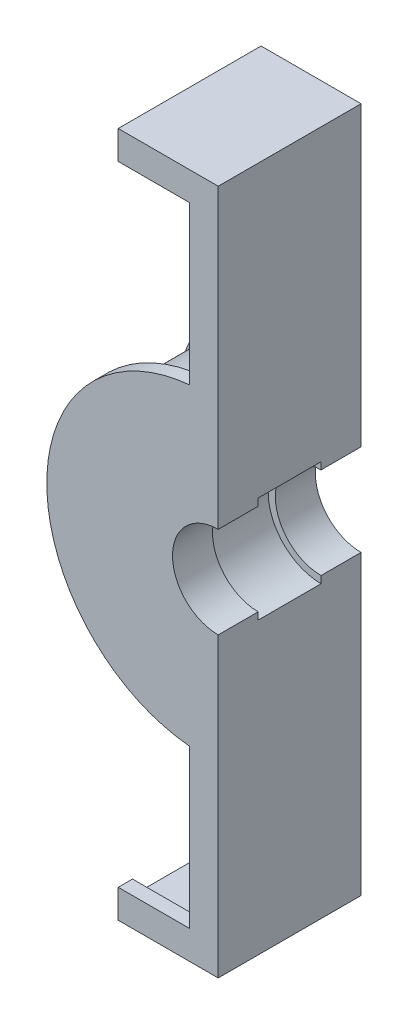
ISO-10303-21;
HEADER;
FILE_DESCRIPTION(('STEP AP214'),'2;1');
FILE_NAME('part.step','',(''),(''),'','','');
FILE_SCHEMA(('AUTOMOTIVE_DESIGN { 1 0 10303 214 1 1 1 1 }'));
ENDSEC;
DATA;
#1=APPLICATION_CONTEXT('core data for automotive mechanical design processes');
#2=APPLICATION_PROTOCOL_DEFINITION('international standard','automotive_design',2000,#1);
#3=PRODUCT_CONTEXT('',#1,'mechanical');
#4=PRODUCT('Part','Part','',(#3));
#5=PRODUCT_RELATED_PRODUCT_CATEGORY('part','',(#4));
#6=PRODUCT_DEFINITION_FORMATION('','',#4);
#7=PRODUCT_DEFINITION_CONTEXT('part definition',#1,'design');
#8=PRODUCT_DEFINITION('design','',#6,#7);
#9=PRODUCT_DEFINITION_SHAPE('','',#8);
#10=(LENGTH_UNIT() NAMED_UNIT(*) SI_UNIT(.MILLI.,.METRE.));
#11=(NAMED_UNIT(*) PLANE_ANGLE_UNIT() SI_UNIT($,.RADIAN.));
#12=(NAMED_UNIT(*) SI_UNIT($,.STERADIAN.) SOLID_ANGLE_UNIT());
#13=UNCERTAINTY_MEASURE_WITH_UNIT(LENGTH_MEASURE(1.E-05),#10,'distance_accuracy_value','');
#14=(GEOMETRIC_REPRESENTATION_CONTEXT(3) GLOBAL_UNCERTAINTY_ASSIGNED_CONTEXT((#13)) GLOBAL_UNIT_ASSIGNED_CONTEXT((#10,
#11,#12)) REPRESENTATION_CONTEXT('',''));
#15=CARTESIAN_POINT('',(0.,0.,0.));
#16=DIRECTION('',(0.,0.,1.));
#17=DIRECTION('',(1.,0.,0.));
#18=AXIS2_PLACEMENT_3D('',#15,#16,#17);
#19=CARTESIAN_POINT('',(5.,0.,45.));
#20=DIRECTION('',(0.,0.,-1.));
#21=DIRECTION('',(-1.,0.,0.));
#22=AXIS2_PLACEMENT_3D('',#19,#20,#21);
#23=CYLINDRICAL_SURFACE('',#22,18.5);
#24=DIRECTION('',(0.,0.,-1.));
#25=VECTOR('',#24,1.);
#26=CARTESIAN_POINT('',(5.,18.5,45.));
#27=LINE('',#26,#25);
#28=CARTESIAN_POINT('',(5.,18.5,31.));
#29=VERTEX_POINT('',#28);
#30=CARTESIAN_POINT('',(5.,18.5,9.));
#31=VERTEX_POINT('',#30);
#32=EDGE_CURVE('E60',#29,#31,#27,.T.);
#33=ORIENTED_EDGE('',*,*,#32,.F.);
#34=CARTESIAN_POINT('',(5.,0.,31.));
#35=DIRECTION('',(0.,0.,-1.));
#36=DIRECTION('',(-1.,0.,0.));
#37=AXIS2_PLACEMENT_3D('',#34,#35,#36);
#38=CIRCLE('',#37,18.5);
#39=CARTESIAN_POINT('',(5.00000000000001,-18.5,31.));
#40=VERTEX_POINT('',#39);
#41=EDGE_CURVE('E55',#40,#29,#38,.T.);
#42=ORIENTED_EDGE('',*,*,#41,.F.);
#43=DIRECTION('',(0.,0.,-1.));
#44=VECTOR('',#43,1.);
#45=CARTESIAN_POINT('',(5.00000000000001,-18.5,45.));
#46=LINE('',#45,#44);
#47=CARTESIAN_POINT('',(5.,-18.5,9.));
#48=VERTEX_POINT('',#47);
#49=EDGE_CURVE('E248',#40,#48,#46,.T.);
#50=ORIENTED_EDGE('',*,*,#49,.T.);
#51=CARTESIAN_POINT('',(5.,0.,9.));
#52=DIRECTION('',(0.,0.,-1.));
#53=DIRECTION('',(-1.,0.,0.));
#54=AXIS2_PLACEMENT_3D('',#51,#52,#53);
#55=CIRCLE('',#54,18.5);
#56=EDGE_CURVE('E261',#48,#31,#55,.T.);
#57=ORIENTED_EDGE('',*,*,#56,.T.);
#58=EDGE_LOOP('',(#33,#42,#50,#57));
#59=FACE_BOUND('',#58,.T.);
#60=ADVANCED_FACE('F39',(#59),#23,.F.);
#61=CARTESIAN_POINT('',(0.,115.,40.));
#62=DIRECTION('',(0.,1.,0.));
#63=DIRECTION('',(0.,0.,1.));
#64=AXIS2_PLACEMENT_3D('',#61,#62,#63);
#65=PLANE('',#64);
#66=DIRECTION('',(1.,0.,0.));
#67=VECTOR('',#66,1.);
#68=CARTESIAN_POINT('',(0.,115.,0.));
#69=LINE('',#68,#67);
#70=CARTESIAN_POINT('',(-30.,115.,0.));
#71=VERTEX_POINT('',#70);
#72=CARTESIAN_POINT('',(0.,115.,0.));
#73=VERTEX_POINT('',#72);
#74=EDGE_CURVE('E459',#71,#73,#69,.T.);
#75=ORIENTED_EDGE('',*,*,#74,.T.);
#76=DIRECTION('',(0.,0.,-1.));
#77=VECTOR('',#76,1.);
#78=CARTESIAN_POINT('',(0.,115.,40.));
#79=LINE('',#78,#77);
#80=CARTESIAN_POINT('',(0.,115.,40.));
#81=VERTEX_POINT('',#80);
#82=EDGE_CURVE('E11',#81,#73,#79,.T.);
#83=ORIENTED_EDGE('',*,*,#82,.F.);
#84=DIRECTION('',(1.,0.,0.));
#85=VECTOR('',#84,1.);
#86=CARTESIAN_POINT('',(0.,115.,40.));
#87=LINE('',#86,#85);
#88=CARTESIAN_POINT('',(-30.,115.,40.));
#89=VERTEX_POINT('',#88);
#90=EDGE_CURVE('E460',#89,#81,#87,.T.);
#91=ORIENTED_EDGE('',*,*,#90,.F.);
#92=DIRECTION('',(0.,0.,-1.));
#93=VECTOR('',#92,1.);
#94=CARTESIAN_POINT('',(-30.,115.,40.));
#95=LINE('',#94,#93);
#96=EDGE_CURVE('E481',#89,#71,#95,.T.);
#97=ORIENTED_EDGE('',*,*,#96,.T.);
#98=EDGE_LOOP('',(#75,#83,#91,#97));
#99=FACE_BOUND('',#98,.T.);
#100=ADVANCED_FACE('F41',(#99),#65,.F.);
#101=CARTESIAN_POINT('',(0.,50.,40.));
#102=DIRECTION('',(1.,0.,0.));
#103=DIRECTION('',(0.,0.,-1.));
#104=AXIS2_PLACEMENT_3D('',#101,#102,#103);
#105=PLANE('',#104);
#106=DIRECTION('',(0.,-1.,0.));
#107=VECTOR('',#106,1.);
#108=CARTESIAN_POINT('',(0.,50.,0.));
#109=LINE('',#108,#107);
#110=CARTESIAN_POINT('',(0.,50.,0.));
#111=VERTEX_POINT('',#110);
#112=EDGE_CURVE('E485',#73,#111,#109,.T.);
#113=ORIENTED_EDGE('',*,*,#112,.T.);
#114=DIRECTION('',(0.,0.,-1.));
#115=VECTOR('',#114,1.);
#116=CARTESIAN_POINT('',(0.,50.,40.));
#117=LINE('',#116,#115);
#118=CARTESIAN_POINT('',(0.,50.,40.));
#119=VERTEX_POINT('',#118);
#120=EDGE_CURVE('E48',#119,#111,#117,.T.);
#121=ORIENTED_EDGE('',*,*,#120,.F.);
#122=DIRECTION('',(0.,-1.,0.));
#123=VECTOR('',#122,1.);
#124=CARTESIAN_POINT('',(0.,50.,40.));
#125=LINE('',#124,#123);
#126=EDGE_CURVE('E464',#81,#119,#125,.T.);
#127=ORIENTED_EDGE('',*,*,#126,.F.);
#128=ORIENTED_EDGE('',*,*,#82,.T.);
#129=EDGE_LOOP('',(#113,#121,#127,#128));
#130=FACE_BOUND('',#129,.T.);
#131=ADVANCED_FACE('F533',(#130),#105,.F.);
#132=CARTESIAN_POINT('',(0.,0.,40.));
#133=DIRECTION('',(0.,0.,-1.));
#134=DIRECTION('',(-1.,0.,0.));
#135=AXIS2_PLACEMENT_3D('',#132,#133,#134);
#136=CYLINDRICAL_SURFACE('',#135,50.);
#137=CARTESIAN_POINT('',(0.,0.,0.));
#138=DIRECTION('',(0.,0.,1.));
#139=DIRECTION('',(1.,0.,0.));
#140=AXIS2_PLACEMENT_3D('',#137,#138,#139);
#141=CIRCLE('',#140,50.);
#142=CARTESIAN_POINT('',(0.,-50.,0.));
#143=VERTEX_POINT('',#142);
#144=EDGE_CURVE('E489',#111,#143,#141,.T.);
#145=ORIENTED_EDGE('',*,*,#144,.T.);
#146=DIRECTION('',(0.,0.,-1.));
#147=VECTOR('',#146,1.);
#148=CARTESIAN_POINT('',(0.,-50.,40.));
#149=LINE('',#148,#147);
#150=CARTESIAN_POINT('',(0.,-50.,40.));
#151=VERTEX_POINT('',#150);
#152=EDGE_CURVE('E524',#151,#143,#149,.T.);
#153=ORIENTED_EDGE('',*,*,#152,.F.);
#154=CARTESIAN_POINT('',(0.,0.,40.));
#155=DIRECTION('',(0.,0.,1.));
#156=DIRECTION('',(1.,0.,0.));
#157=AXIS2_PLACEMENT_3D('',#154,#155,#156);
#158=CIRCLE('',#157,50.);
#159=EDGE_CURVE('E469',#119,#151,#158,.T.);
#160=ORIENTED_EDGE('',*,*,#159,.F.);
#161=ORIENTED_EDGE('',*,*,#120,.T.);
#162=EDGE_LOOP('',(#145,#153,#160,#161));
#163=FACE_BOUND('',#162,.T.);
#164=ADVANCED_FACE('F531',(#163),#136,.T.);
#165=CARTESIAN_POINT('',(0.,-50.,40.));
#166=DIRECTION('',(1.,0.,0.));
#167=DIRECTION('',(0.,0.,-1.));
#168=AXIS2_PLACEMENT_3D('',#165,#166,#167);
#169=PLANE('',#168);
#170=DIRECTION('',(0.,-1.,0.));
#171=VECTOR('',#170,1.);
#172=CARTESIAN_POINT('',(0.,-50.,0.));
#173=LINE('',#172,#171);
#174=CARTESIAN_POINT('',(0.,-115.,0.));
#175=VERTEX_POINT('',#174);
#176=EDGE_CURVE('E493',#143,#175,#173,.T.);
#177=ORIENTED_EDGE('',*,*,#176,.T.);
#178=DIRECTION('',(0.,0.,-1.));
#179=VECTOR('',#178,1.);
#180=CARTESIAN_POINT('',(0.,-115.,40.));
#181=LINE('',#180,#179);
#182=CARTESIAN_POINT('',(0.,-115.,40.));
#183=VERTEX_POINT('',#182);
#184=EDGE_CURVE('E520',#183,#175,#181,.T.);
#185=ORIENTED_EDGE('',*,*,#184,.F.);
#186=DIRECTION('',(0.,-1.,0.));
#187=VECTOR('',#186,1.);
#188=CARTESIAN_POINT('',(0.,-50.,40.));
#189=LINE('',#188,#187);
#190=EDGE_CURVE('E473',#151,#183,#189,.T.);
#191=ORIENTED_EDGE('',*,*,#190,.F.);
#192=ORIENTED_EDGE('',*,*,#152,.T.);
#193=EDGE_LOOP('',(#177,#185,#191,#192));
#194=FACE_BOUND('',#193,.T.);
#195=ADVANCED_FACE('F539',(#194),#169,.F.);
#196=CARTESIAN_POINT('',(-30.,-115.,40.));
#197=DIRECTION('',(0.,-1.,0.));
#198=DIRECTION('',(0.,0.,-1.));
#199=AXIS2_PLACEMENT_3D('',#196,#197,#198);
#200=PLANE('',#199);
#201=DIRECTION('',(-1.,0.,0.));
#202=VECTOR('',#201,1.);
#203=CARTESIAN_POINT('',(-30.,-115.,0.));
#204=LINE('',#203,#202);
#205=CARTESIAN_POINT('',(-30.,-115.,0.));
#206=VERTEX_POINT('',#205);
#207=EDGE_CURVE('E465',#175,#206,#204,.T.);
#208=ORIENTED_EDGE('',*,*,#207,.T.);
#209=DIRECTION('',(0.,0.,-1.));
#210=VECTOR('',#209,1.);
#211=CARTESIAN_POINT('',(-30.,-115.,40.));
#212=LINE('',#211,#210);
#213=CARTESIAN_POINT('',(-30.,-115.,40.));
#214=VERTEX_POINT('',#213);
#215=EDGE_CURVE('E516',#214,#206,#212,.T.);
#216=ORIENTED_EDGE('',*,*,#215,.F.);
#217=DIRECTION('',(-1.,0.,0.));
#218=VECTOR('',#217,1.);
#219=CARTESIAN_POINT('',(-30.,-115.,40.));
#220=LINE('',#219,#218);
#221=EDGE_CURVE('E477',#183,#214,#220,.T.);
#222=ORIENTED_EDGE('',*,*,#221,.F.);
#223=ORIENTED_EDGE('',*,*,#184,.T.);
#224=EDGE_LOOP('',(#208,#216,#222,#223));
#225=FACE_BOUND('',#224,.T.);
#226=ADVANCED_FACE('F543',(#225),#200,.F.);
#227=CARTESIAN_POINT('',(-30.,-120.,40.));
#228=DIRECTION('',(1.,0.,0.));
#229=DIRECTION('',(0.,0.,-1.));
#230=AXIS2_PLACEMENT_3D('',#227,#228,#229);
#231=PLANE('',#230);
#232=ORIENTED_EDGE('',*,*,#215,.T.);
#233=DIRECTION('',(0.,-1.,0.));
#234=VECTOR('',#233,1.);
#235=CARTESIAN_POINT('',(-30.,-120.,0.));
#236=LINE('',#235,#234);
#237=CARTESIAN_POINT('',(-30.,-110.,0.));
#238=VERTEX_POINT('',#237);
#239=EDGE_CURVE('E288',#238,#206,#236,.T.);
#240=ORIENTED_EDGE('',*,*,#239,.F.);
#241=DIRECTION('',(0.,0.,1.));
#242=VECTOR('',#241,1.);
#243=CARTESIAN_POINT('',(-30.,-110.,-5.));
#244=LINE('',#243,#242);
#245=CARTESIAN_POINT('',(-30.,-110.,-5.));
#246=VERTEX_POINT('',#245);
#247=EDGE_CURVE('E374',#246,#238,#244,.T.);
#248=ORIENTED_EDGE('',*,*,#247,.F.);
#249=DIRECTION('',(0.,-1.,0.));
#250=VECTOR('',#249,1.);
#251=CARTESIAN_POINT('',(-30.,-120.,-5.));
#252=LINE('',#251,#250);
#253=CARTESIAN_POINT('',(-30.,-120.,-5.));
#254=VERTEX_POINT('',#253);
#255=EDGE_CURVE('E302',#246,#254,#252,.T.);
#256=ORIENTED_EDGE('',*,*,#255,.T.);
#257=DIRECTION('',(0.,0.,-1.));
#258=VECTOR('',#257,1.);
#259=CARTESIAN_POINT('',(-30.,-120.,40.));
#260=LINE('',#259,#258);
#261=CARTESIAN_POINT('',(-30.,-120.,45.));
#262=VERTEX_POINT('',#261);
#263=EDGE_CURVE('E513',#262,#254,#260,.T.);
#264=ORIENTED_EDGE('',*,*,#263,.F.);
#265=DIRECTION('',(0.,-1.,0.));
#266=VECTOR('',#265,1.);
#267=CARTESIAN_POINT('',(-30.,-120.,45.));
#268=LINE('',#267,#266);
#269=CARTESIAN_POINT('',(-30.,-110.,45.));
#270=VERTEX_POINT('',#269);
#271=EDGE_CURVE('E404',#270,#262,#268,.T.);
#272=ORIENTED_EDGE('',*,*,#271,.F.);
#273=DIRECTION('',(0.,0.,-1.));
#274=VECTOR('',#273,1.);
#275=CARTESIAN_POINT('',(-30.,-110.,45.));
#276=LINE('',#275,#274);
#277=CARTESIAN_POINT('',(-30.,-110.,40.));
#278=VERTEX_POINT('',#277);
#279=EDGE_CURVE('E415',#270,#278,#276,.T.);
#280=ORIENTED_EDGE('',*,*,#279,.T.);
#281=DIRECTION('',(0.,-1.,0.));
#282=VECTOR('',#281,1.);
#283=CARTESIAN_POINT('',(-30.,-120.,40.));
#284=LINE('',#283,#282);
#285=EDGE_CURVE('E382',#278,#214,#284,.T.);
#286=ORIENTED_EDGE('',*,*,#285,.T.);
#287=EDGE_LOOP('',(#232,#240,#248,#256,#264,#272,#280,#286));
#288=FACE_BOUND('',#287,.T.);
#289=ADVANCED_FACE('F577',(#288),#231,.F.);
#290=CARTESIAN_POINT('',(5.,-120.,40.));
#291=DIRECTION('',(0.,1.,0.));
#292=DIRECTION('',(0.,0.,1.));
#293=AXIS2_PLACEMENT_3D('',#290,#291,#292);
#294=PLANE('',#293);
#295=ORIENTED_EDGE('',*,*,#263,.T.);
#296=DIRECTION('',(1.,0.,0.));
#297=VECTOR('',#296,1.);
#298=CARTESIAN_POINT('',(5.,-120.,-5.));
#299=LINE('',#298,#297);
#300=CARTESIAN_POINT('',(5.,-120.,-5.));
#301=VERTEX_POINT('',#300);
#302=EDGE_CURVE('E298',#254,#301,#299,.T.);
#303=ORIENTED_EDGE('',*,*,#302,.T.);
#304=DIRECTION('',(0.,0.,-1.));
#305=VECTOR('',#304,1.);
#306=CARTESIAN_POINT('',(5.,-120.,40.));
#307=LINE('',#306,#305);
#308=CARTESIAN_POINT('',(5.,-120.,45.));
#309=VERTEX_POINT('',#308);
#310=EDGE_CURVE('E510',#309,#301,#307,.T.);
#311=ORIENTED_EDGE('',*,*,#310,.F.);
#312=DIRECTION('',(1.,0.,0.));
#313=VECTOR('',#312,1.);
#314=CARTESIAN_POINT('',(5.,-120.,45.));
#315=LINE('',#314,#313);
#316=EDGE_CURVE('E408',#262,#309,#315,.T.);
#317=ORIENTED_EDGE('',*,*,#316,.F.);
#318=EDGE_LOOP('',(#295,#303,#311,#317));
#319=FACE_BOUND('',#318,.T.);
#320=ADVANCED_FACE('F618',(#319),#294,.F.);
#321=CARTESIAN_POINT('',(5.,-45.,40.));
#322=DIRECTION('',(-1.,0.,0.));
#323=DIRECTION('',(0.,0.,1.));
#324=AXIS2_PLACEMENT_3D('',#321,#322,#323);
#325=PLANE('',#324);
#326=ORIENTED_EDGE('',*,*,#310,.T.);
#327=DIRECTION('',(0.,1.,0.));
#328=VECTOR('',#327,1.);
#329=CARTESIAN_POINT('',(5.,-45.,-5.));
#330=LINE('',#329,#328);
#331=CARTESIAN_POINT('',(5.00000000000001,-16.,-5.));
#332=VERTEX_POINT('',#331);
#333=EDGE_CURVE('E294',#301,#332,#330,.T.);
#334=ORIENTED_EDGE('',*,*,#333,.T.);
#335=DIRECTION('',(0.,0.,-1.));
#336=VECTOR('',#335,1.);
#337=CARTESIAN_POINT('',(5.00000000000001,-16.,9.));
#338=LINE('',#337,#336);
#339=CARTESIAN_POINT('',(5.00000000000001,-16.,9.));
#340=VERTEX_POINT('',#339);
#341=EDGE_CURVE('E279',#340,#332,#338,.T.);
#342=ORIENTED_EDGE('',*,*,#341,.F.);
#343=DIRECTION('',(0.,-1.,0.));
#344=VECTOR('',#343,1.);
#345=CARTESIAN_POINT('',(5.,-18.5,9.));
#346=LINE('',#345,#344);
#347=EDGE_CURVE('E272',#340,#48,#346,.T.);
#348=ORIENTED_EDGE('',*,*,#347,.T.);
#349=ORIENTED_EDGE('',*,*,#49,.F.);
#350=DIRECTION('',(0.,-1.,0.));
#351=VECTOR('',#350,1.);
#352=CARTESIAN_POINT('',(5.,-18.5,31.));
#353=LINE('',#352,#351);
#354=CARTESIAN_POINT('',(5.00000000000001,-16.,31.));
#355=VERTEX_POINT('',#354);
#356=EDGE_CURVE('E228',#355,#40,#353,.T.);
#357=ORIENTED_EDGE('',*,*,#356,.F.);
#358=DIRECTION('',(0.,0.,1.));
#359=VECTOR('',#358,1.);
#360=CARTESIAN_POINT('',(5.00000000000001,-16.,31.));
#361=LINE('',#360,#359);
#362=CARTESIAN_POINT('',(5.00000000000001,-16.,45.));
#363=VERTEX_POINT('',#362);
#364=EDGE_CURVE('E237',#355,#363,#361,.T.);
#365=ORIENTED_EDGE('',*,*,#364,.T.);
#366=DIRECTION('',(0.,1.,0.));
#367=VECTOR('',#366,1.);
#368=CARTESIAN_POINT('',(5.,-45.,45.));
#369=LINE('',#368,#367);
#370=EDGE_CURVE('E412',#309,#363,#369,.T.);
#371=ORIENTED_EDGE('',*,*,#370,.F.);
#372=EDGE_LOOP('',(#326,#334,#342,#348,#349,#357,#365,#371));
#373=FACE_BOUND('',#372,.T.);
#374=ADVANCED_FACE('F246',(#373),#325,.F.);
#375=CARTESIAN_POINT('',(5.,120.,40.));
#376=DIRECTION('',(-1.,0.,0.));
#377=DIRECTION('',(0.,0.,1.));
#378=AXIS2_PLACEMENT_3D('',#375,#376,#377);
#379=PLANE('',#378);
#380=DIRECTION('',(0.,0.,-1.));
#381=VECTOR('',#380,1.);
#382=CARTESIAN_POINT('',(5.,120.,40.));
#383=LINE('',#382,#381);
#384=CARTESIAN_POINT('',(5.,120.,45.));
#385=VERTEX_POINT('',#384);
#386=CARTESIAN_POINT('',(5.,120.,-5.));
#387=VERTEX_POINT('',#386);
#388=EDGE_CURVE('E506',#385,#387,#383,.T.);
#389=ORIENTED_EDGE('',*,*,#388,.F.);
#390=DIRECTION('',(0.,1.,0.));
#391=VECTOR('',#390,1.);
#392=CARTESIAN_POINT('',(5.,120.,45.));
#393=LINE('',#392,#391);
#394=CARTESIAN_POINT('',(5.,16.,45.));
#395=VERTEX_POINT('',#394);
#396=EDGE_CURVE('E378',#395,#385,#393,.T.);
#397=ORIENTED_EDGE('',*,*,#396,.F.);
#398=DIRECTION('',(0.,0.,1.));
#399=VECTOR('',#398,1.);
#400=CARTESIAN_POINT('',(5.,16.,31.));
#401=LINE('',#400,#399);
#402=CARTESIAN_POINT('',(5.,16.,31.));
#403=VERTEX_POINT('',#402);
#404=EDGE_CURVE('E244',#403,#395,#401,.T.);
#405=ORIENTED_EDGE('',*,*,#404,.F.);
#406=DIRECTION('',(0.,-1.,0.));
#407=VECTOR('',#406,1.);
#408=CARTESIAN_POINT('',(5.,18.5,31.));
#409=LINE('',#408,#407);
#410=EDGE_CURVE('E229',#29,#403,#409,.T.);
#411=ORIENTED_EDGE('',*,*,#410,.F.);
#412=ORIENTED_EDGE('',*,*,#32,.T.);
#413=DIRECTION('',(0.,-1.,0.));
#414=VECTOR('',#413,1.);
#415=CARTESIAN_POINT('',(5.,18.5,9.));
#416=LINE('',#415,#414);
#417=CARTESIAN_POINT('',(5.,16.,9.));
#418=VERTEX_POINT('',#417);
#419=EDGE_CURVE('E264',#31,#418,#416,.T.);
#420=ORIENTED_EDGE('',*,*,#419,.T.);
#421=DIRECTION('',(0.,0.,-1.));
#422=VECTOR('',#421,1.);
#423=CARTESIAN_POINT('',(5.,16.,9.));
#424=LINE('',#423,#422);
#425=CARTESIAN_POINT('',(5.,16.,-5.));
#426=VERTEX_POINT('',#425);
#427=EDGE_CURVE('E275',#418,#426,#424,.T.);
#428=ORIENTED_EDGE('',*,*,#427,.T.);
#429=DIRECTION('',(0.,1.,0.));
#430=VECTOR('',#429,1.);
#431=CARTESIAN_POINT('',(5.,120.,-5.));
#432=LINE('',#431,#430);
#433=EDGE_CURVE('E291',#426,#387,#432,.T.);
#434=ORIENTED_EDGE('',*,*,#433,.T.);
#435=EDGE_LOOP('',(#389,#397,#405,#411,#412,#420,#428,#434));
#436=FACE_BOUND('',#435,.T.);
#437=ADVANCED_FACE('F670',(#436),#379,.F.);
#438=CARTESIAN_POINT('',(-30.,120.,40.));
#439=DIRECTION('',(0.,-1.,0.));
#440=DIRECTION('',(0.,0.,-1.));
#441=AXIS2_PLACEMENT_3D('',#438,#439,#440);
#442=PLANE('',#441);
#443=ORIENTED_EDGE('',*,*,#388,.T.);
#444=DIRECTION('',(-1.,0.,0.));
#445=VECTOR('',#444,1.);
#446=CARTESIAN_POINT('',(5.,120.,-5.));
#447=LINE('',#446,#445);
#448=CARTESIAN_POINT('',(-30.,120.,-5.));
#449=VERTEX_POINT('',#448);
#450=EDGE_CURVE('E330',#387,#449,#447,.T.);
#451=ORIENTED_EDGE('',*,*,#450,.T.);
#452=DIRECTION('',(0.,0.,-1.));
#453=VECTOR('',#452,1.);
#454=CARTESIAN_POINT('',(-30.,120.,40.));
#455=LINE('',#454,#453);
#456=CARTESIAN_POINT('',(-30.,120.,45.));
#457=VERTEX_POINT('',#456);
#458=EDGE_CURVE('E503',#457,#449,#455,.T.);
#459=ORIENTED_EDGE('',*,*,#458,.F.);
#460=DIRECTION('',(-1.,0.,0.));
#461=VECTOR('',#460,1.);
#462=CARTESIAN_POINT('',(5.,120.,45.));
#463=LINE('',#462,#461);
#464=EDGE_CURVE('E381',#385,#457,#463,.T.);
#465=ORIENTED_EDGE('',*,*,#464,.F.);
#466=EDGE_LOOP('',(#443,#451,#459,#465));
#467=FACE_BOUND('',#466,.T.);
#468=ADVANCED_FACE('F610',(#467),#442,.F.);
#469=CARTESIAN_POINT('',(-30.,115.,40.));
#470=DIRECTION('',(1.,0.,0.));
#471=DIRECTION('',(0.,0.,-1.));
#472=AXIS2_PLACEMENT_3D('',#469,#470,#471);
#473=PLANE('',#472);
#474=ORIENTED_EDGE('',*,*,#458,.T.);
#475=DIRECTION('',(0.,-1.,0.));
#476=VECTOR('',#475,1.);
#477=CARTESIAN_POINT('',(-30.,120.,-5.));
#478=LINE('',#477,#476);
#479=CARTESIAN_POINT('',(-30.,110.,-5.));
#480=VERTEX_POINT('',#479);
#481=EDGE_CURVE('E326',#449,#480,#478,.T.);
#482=ORIENTED_EDGE('',*,*,#481,.T.);
#483=DIRECTION('',(0.,0.,1.));
#484=VECTOR('',#483,1.);
#485=CARTESIAN_POINT('',(-30.,110.,-5.));
#486=LINE('',#485,#484);
#487=CARTESIAN_POINT('',(-30.,110.,0.));
#488=VERTEX_POINT('',#487);
#489=EDGE_CURVE('E334',#480,#488,#486,.T.);
#490=ORIENTED_EDGE('',*,*,#489,.T.);
#491=DIRECTION('',(0.,-1.,0.));
#492=VECTOR('',#491,1.);
#493=CARTESIAN_POINT('',(-30.,120.,0.));
#494=LINE('',#493,#492);
#495=EDGE_CURVE('E295',#71,#488,#494,.T.);
#496=ORIENTED_EDGE('',*,*,#495,.F.);
#497=ORIENTED_EDGE('',*,*,#96,.F.);
#498=DIRECTION('',(0.,-1.,0.));
#499=VECTOR('',#498,1.);
#500=CARTESIAN_POINT('',(-30.,120.,40.));
#501=LINE('',#500,#499);
#502=CARTESIAN_POINT('',(-30.,110.,40.));
#503=VERTEX_POINT('',#502);
#504=EDGE_CURVE('E377',#89,#503,#501,.T.);
#505=ORIENTED_EDGE('',*,*,#504,.T.);
#506=DIRECTION('',(0.,0.,-1.));
#507=VECTOR('',#506,1.);
#508=CARTESIAN_POINT('',(-30.,110.,45.));
#509=LINE('',#508,#507);
#510=CARTESIAN_POINT('',(-30.,110.,45.));
#511=VERTEX_POINT('',#510);
#512=EDGE_CURVE('E455',#511,#503,#509,.T.);
#513=ORIENTED_EDGE('',*,*,#512,.F.);
#514=DIRECTION('',(0.,-1.,0.));
#515=VECTOR('',#514,1.);
#516=CARTESIAN_POINT('',(-30.,120.,45.));
#517=LINE('',#516,#515);
#518=EDGE_CURVE('E386',#457,#511,#517,.T.);
#519=ORIENTED_EDGE('',*,*,#518,.F.);
#520=EDGE_LOOP('',(#474,#482,#490,#496,#497,#505,#513,#519));
#521=FACE_BOUND('',#520,.T.);
#522=ADVANCED_FACE('F552',(#521),#473,.F.);
#523=CARTESIAN_POINT('',(0.,0.,40.));
#524=DIRECTION('',(0.,0.,1.));
#525=DIRECTION('',(1.,0.,0.));
#526=AXIS2_PLACEMENT_3D('',#523,#524,#525);
#527=PLANE('',#526);
#528=ORIENTED_EDGE('',*,*,#504,.F.);
#529=ORIENTED_EDGE('',*,*,#90,.T.);
#530=ORIENTED_EDGE('',*,*,#126,.T.);
#531=ORIENTED_EDGE('',*,*,#159,.T.);
#532=ORIENTED_EDGE('',*,*,#190,.T.);
#533=ORIENTED_EDGE('',*,*,#221,.T.);
#534=ORIENTED_EDGE('',*,*,#285,.F.);
#535=DIRECTION('',(-1.,0.,0.));
#536=VECTOR('',#535,1.);
#537=CARTESIAN_POINT('',(-30.,-110.,40.));
#538=LINE('',#537,#536);
#539=CARTESIAN_POINT('',(-5.,-110.,40.));
#540=VERTEX_POINT('',#539);
#541=EDGE_CURVE('E430',#540,#278,#538,.T.);
#542=ORIENTED_EDGE('',*,*,#541,.F.);
#543=DIRECTION('',(0.,-1.,0.));
#544=VECTOR('',#543,1.);
#545=CARTESIAN_POINT('',(-5.,-110.,40.));
#546=LINE('',#545,#544);
#547=CARTESIAN_POINT('',(-4.99999999999998,-54.7722557505166,40.));
#548=VERTEX_POINT('',#547);
#549=EDGE_CURVE('E427',#548,#540,#546,.T.);
#550=ORIENTED_EDGE('',*,*,#549,.F.);
#551=CARTESIAN_POINT('',(0.,0.,40.));
#552=DIRECTION('',(0.,0.,1.));
#553=DIRECTION('',(1.,0.,0.));
#554=AXIS2_PLACEMENT_3D('',#551,#552,#553);
#555=CIRCLE('',#554,55.);
#556=CARTESIAN_POINT('',(-5.,54.7722557505166,40.));
#557=VERTEX_POINT('',#556);
#558=EDGE_CURVE('E424',#557,#548,#555,.T.);
#559=ORIENTED_EDGE('',*,*,#558,.F.);
#560=DIRECTION('',(0.,-1.,0.));
#561=VECTOR('',#560,1.);
#562=CARTESIAN_POINT('',(-5.,110.,40.));
#563=LINE('',#562,#561);
#564=CARTESIAN_POINT('',(-5.,110.,40.));
#565=VERTEX_POINT('',#564);
#566=EDGE_CURVE('E421',#565,#557,#563,.T.);
#567=ORIENTED_EDGE('',*,*,#566,.F.);
#568=DIRECTION('',(1.,0.,0.));
#569=VECTOR('',#568,1.);
#570=CARTESIAN_POINT('',(-30.,110.,40.));
#571=LINE('',#570,#569);
#572=EDGE_CURVE('E418',#503,#565,#571,.T.);
#573=ORIENTED_EDGE('',*,*,#572,.F.);
#574=EDGE_LOOP('',(#528,#529,#530,#531,#532,#533,#534,#542,#550,#559,#567,#573));
#575=FACE_BOUND('',#574,.T.);
#576=ADVANCED_FACE('F547',(#575),#527,.F.);
#577=CARTESIAN_POINT('',(-30.,110.,45.));
#578=DIRECTION('',(0.,1.,0.));
#579=DIRECTION('',(0.,0.,1.));
#580=AXIS2_PLACEMENT_3D('',#577,#578,#579);
#581=PLANE('',#580);
#582=ORIENTED_EDGE('',*,*,#572,.T.);
#583=DIRECTION('',(0.,0.,-1.));
#584=VECTOR('',#583,1.);
#585=CARTESIAN_POINT('',(-5.,110.,45.));
#586=LINE('',#585,#584);
#587=CARTESIAN_POINT('',(-5.,110.,45.));
#588=VERTEX_POINT('',#587);
#589=EDGE_CURVE('E451',#588,#565,#586,.T.);
#590=ORIENTED_EDGE('',*,*,#589,.F.);
#591=DIRECTION('',(1.,0.,0.));
#592=VECTOR('',#591,1.);
#593=CARTESIAN_POINT('',(-30.,110.,45.));
#594=LINE('',#593,#592);
#595=EDGE_CURVE('E389',#511,#588,#594,.T.);
#596=ORIENTED_EDGE('',*,*,#595,.F.);
#597=ORIENTED_EDGE('',*,*,#512,.T.);
#598=EDGE_LOOP('',(#582,#590,#596,#597));
#599=FACE_BOUND('',#598,.T.);
#600=ADVANCED_FACE('F602',(#599),#581,.F.);
#601=CARTESIAN_POINT('',(-5.,110.,45.));
#602=DIRECTION('',(1.,0.,0.));
#603=DIRECTION('',(0.,0.,-1.));
#604=AXIS2_PLACEMENT_3D('',#601,#602,#603);
#605=PLANE('',#604);
#606=ORIENTED_EDGE('',*,*,#566,.T.);
#607=DIRECTION('',(0.,0.,-1.));
#608=VECTOR('',#607,1.);
#609=CARTESIAN_POINT('',(-5.,54.7722557505166,45.));
#610=LINE('',#609,#608);
#611=CARTESIAN_POINT('',(-5.,54.7722557505166,45.));
#612=VERTEX_POINT('',#611);
#613=EDGE_CURVE('E447',#612,#557,#610,.T.);
#614=ORIENTED_EDGE('',*,*,#613,.F.);
#615=DIRECTION('',(0.,-1.,0.));
#616=VECTOR('',#615,1.);
#617=CARTESIAN_POINT('',(-5.,110.,45.));
#618=LINE('',#617,#616);
#619=EDGE_CURVE('E392',#588,#612,#618,.T.);
#620=ORIENTED_EDGE('',*,*,#619,.F.);
#621=ORIENTED_EDGE('',*,*,#589,.T.);
#622=EDGE_LOOP('',(#606,#614,#620,#621));
#623=FACE_BOUND('',#622,.T.);
#624=ADVANCED_FACE('F597',(#623),#605,.F.);
#625=CARTESIAN_POINT('',(0.,0.,45.));
#626=DIRECTION('',(0.,0.,-1.));
#627=DIRECTION('',(-1.,0.,0.));
#628=AXIS2_PLACEMENT_3D('',#625,#626,#627);
#629=CYLINDRICAL_SURFACE('',#628,55.);
#630=ORIENTED_EDGE('',*,*,#558,.T.);
#631=DIRECTION('',(0.,0.,-1.));
#632=VECTOR('',#631,1.);
#633=CARTESIAN_POINT('',(-4.99999999999998,-54.7722557505166,45.));
#634=LINE('',#633,#632);
#635=CARTESIAN_POINT('',(-4.99999999999998,-54.7722557505166,45.));
#636=VERTEX_POINT('',#635);
#637=EDGE_CURVE('E443',#636,#548,#634,.T.);
#638=ORIENTED_EDGE('',*,*,#637,.F.);
#639=CARTESIAN_POINT('',(0.,0.,45.));
#640=DIRECTION('',(0.,0.,1.));
#641=DIRECTION('',(1.,0.,0.));
#642=AXIS2_PLACEMENT_3D('',#639,#640,#641);
#643=CIRCLE('',#642,55.);
#644=EDGE_CURVE('E395',#612,#636,#643,.T.);
#645=ORIENTED_EDGE('',*,*,#644,.F.);
#646=ORIENTED_EDGE('',*,*,#613,.T.);
#647=EDGE_LOOP('',(#630,#638,#645,#646));
#648=FACE_BOUND('',#647,.T.);
#649=ADVANCED_FACE('F593',(#648),#629,.T.);
#650=CARTESIAN_POINT('',(-5.,-110.,45.));
#651=DIRECTION('',(1.,0.,0.));
#652=DIRECTION('',(0.,0.,-1.));
#653=AXIS2_PLACEMENT_3D('',#650,#651,#652);
#654=PLANE('',#653);
#655=ORIENTED_EDGE('',*,*,#549,.T.);
#656=DIRECTION('',(0.,0.,-1.));
#657=VECTOR('',#656,1.);
#658=CARTESIAN_POINT('',(-5.,-110.,45.));
#659=LINE('',#658,#657);
#660=CARTESIAN_POINT('',(-5.,-110.,45.));
#661=VERTEX_POINT('',#660);
#662=EDGE_CURVE('E439',#661,#540,#659,.T.);
#663=ORIENTED_EDGE('',*,*,#662,.F.);
#664=DIRECTION('',(0.,-1.,0.));
#665=VECTOR('',#664,1.);
#666=CARTESIAN_POINT('',(-5.,-110.,45.));
#667=LINE('',#666,#665);
#668=EDGE_CURVE('E398',#636,#661,#667,.T.);
#669=ORIENTED_EDGE('',*,*,#668,.F.);
#670=ORIENTED_EDGE('',*,*,#637,.T.);
#671=EDGE_LOOP('',(#655,#663,#669,#670));
#672=FACE_BOUND('',#671,.T.);
#673=ADVANCED_FACE('F589',(#672),#654,.F.);
#674=CARTESIAN_POINT('',(-30.,-110.,45.));
#675=DIRECTION('',(0.,-1.,0.));
#676=DIRECTION('',(0.,0.,-1.));
#677=AXIS2_PLACEMENT_3D('',#674,#675,#676);
#678=PLANE('',#677);
#679=ORIENTED_EDGE('',*,*,#541,.T.);
#680=ORIENTED_EDGE('',*,*,#279,.F.);
#681=DIRECTION('',(-1.,0.,0.));
#682=VECTOR('',#681,1.);
#683=CARTESIAN_POINT('',(-30.,-110.,45.));
#684=LINE('',#683,#682);
#685=EDGE_CURVE('E401',#661,#270,#684,.T.);
#686=ORIENTED_EDGE('',*,*,#685,.F.);
#687=ORIENTED_EDGE('',*,*,#662,.T.);
#688=EDGE_LOOP('',(#679,#680,#686,#687));
#689=FACE_BOUND('',#688,.T.);
#690=ADVANCED_FACE('F584',(#689),#678,.F.);
#691=CARTESIAN_POINT('',(0.,0.,45.));
#692=DIRECTION('',(0.,0.,1.));
#693=DIRECTION('',(1.,0.,0.));
#694=AXIS2_PLACEMENT_3D('',#691,#692,#693);
#695=PLANE('',#694);
#696=ORIENTED_EDGE('',*,*,#370,.T.);
#697=CARTESIAN_POINT('',(5.,0.,45.));
#698=DIRECTION('',(0.,0.,1.));
#699=DIRECTION('',(-1.,0.,0.));
#700=AXIS2_PLACEMENT_3D('',#697,#698,#699);
#701=CIRCLE('',#700,16.);
#702=EDGE_CURVE('E240',#395,#363,#701,.T.);
#703=ORIENTED_EDGE('',*,*,#702,.F.);
#704=ORIENTED_EDGE('',*,*,#396,.T.);
#705=ORIENTED_EDGE('',*,*,#464,.T.);
#706=ORIENTED_EDGE('',*,*,#518,.T.);
#707=ORIENTED_EDGE('',*,*,#595,.T.);
#708=ORIENTED_EDGE('',*,*,#619,.T.);
#709=ORIENTED_EDGE('',*,*,#644,.T.);
#710=ORIENTED_EDGE('',*,*,#668,.T.);
#711=ORIENTED_EDGE('',*,*,#685,.T.);
#712=ORIENTED_EDGE('',*,*,#271,.T.);
#713=ORIENTED_EDGE('',*,*,#316,.T.);
#714=EDGE_LOOP('',(#696,#703,#704,#705,#706,#707,#708,#709,#710,#711,#712,#713));
#715=FACE_BOUND('',#714,.T.);
#716=ADVANCED_FACE('F606',(#715),#695,.T.);
#717=CARTESIAN_POINT('',(-30.,-110.,-5.));
#718=DIRECTION('',(0.,1.,0.));
#719=DIRECTION('',(0.,0.,1.));
#720=AXIS2_PLACEMENT_3D('',#717,#718,#719);
#721=PLANE('',#720);
#722=DIRECTION('',(-1.,0.,0.));
#723=VECTOR('',#722,1.);
#724=CARTESIAN_POINT('',(-30.,-110.,0.));
#725=LINE('',#724,#723);
#726=CARTESIAN_POINT('',(-5.,-110.,0.));
#727=VERTEX_POINT('',#726);
#728=EDGE_CURVE('E337',#727,#238,#725,.T.);
#729=ORIENTED_EDGE('',*,*,#728,.F.);
#730=DIRECTION('',(0.,0.,1.));
#731=VECTOR('',#730,1.);
#732=CARTESIAN_POINT('',(-5.,-110.,-5.));
#733=LINE('',#732,#731);
#734=CARTESIAN_POINT('',(-5.,-110.,-5.));
#735=VERTEX_POINT('',#734);
#736=EDGE_CURVE('E371',#735,#727,#733,.T.);
#737=ORIENTED_EDGE('',*,*,#736,.F.);
#738=DIRECTION('',(-1.,0.,0.));
#739=VECTOR('',#738,1.);
#740=CARTESIAN_POINT('',(-30.,-110.,-5.));
#741=LINE('',#740,#739);
#742=EDGE_CURVE('E306',#735,#246,#741,.T.);
#743=ORIENTED_EDGE('',*,*,#742,.T.);
#744=ORIENTED_EDGE('',*,*,#247,.T.);
#745=EDGE_LOOP('',(#729,#737,#743,#744));
#746=FACE_BOUND('',#745,.T.);
#747=ADVANCED_FACE('F573',(#746),#721,.T.);
#748=CARTESIAN_POINT('',(-5.,-110.,-5.));
#749=DIRECTION('',(-1.,0.,0.));
#750=DIRECTION('',(0.,0.,1.));
#751=AXIS2_PLACEMENT_3D('',#748,#749,#750);
#752=PLANE('',#751);
#753=DIRECTION('',(0.,-1.,0.));
#754=VECTOR('',#753,1.);
#755=CARTESIAN_POINT('',(-5.,-110.,0.));
#756=LINE('',#755,#754);
#757=CARTESIAN_POINT('',(-4.99999999999998,-54.7722557505166,0.));
#758=VERTEX_POINT('',#757);
#759=EDGE_CURVE('E341',#758,#727,#756,.T.);
#760=ORIENTED_EDGE('',*,*,#759,.F.);
#761=DIRECTION('',(0.,0.,1.));
#762=VECTOR('',#761,1.);
#763=CARTESIAN_POINT('',(-4.99999999999998,-54.7722557505166,-5.));
#764=LINE('',#763,#762);
#765=CARTESIAN_POINT('',(-4.99999999999998,-54.7722557505166,-5.));
#766=VERTEX_POINT('',#765);
#767=EDGE_CURVE('E368',#766,#758,#764,.T.);
#768=ORIENTED_EDGE('',*,*,#767,.F.);
#769=DIRECTION('',(0.,-1.,0.));
#770=VECTOR('',#769,1.);
#771=CARTESIAN_POINT('',(-5.,-110.,-5.));
#772=LINE('',#771,#770);
#773=EDGE_CURVE('E310',#766,#735,#772,.T.);
#774=ORIENTED_EDGE('',*,*,#773,.T.);
#775=ORIENTED_EDGE('',*,*,#736,.T.);
#776=EDGE_LOOP('',(#760,#768,#774,#775));
#777=FACE_BOUND('',#776,.T.);
#778=ADVANCED_FACE('F569',(#777),#752,.T.);
#779=CARTESIAN_POINT('',(0.,0.,-5.));
#780=DIRECTION('',(0.,0.,1.));
#781=DIRECTION('',(1.,0.,0.));
#782=AXIS2_PLACEMENT_3D('',#779,#780,#781);
#783=CYLINDRICAL_SURFACE('',#782,55.);
#784=CARTESIAN_POINT('',(0.,0.,0.));
#785=DIRECTION('',(0.,0.,1.));
#786=DIRECTION('',(1.,0.,0.));
#787=AXIS2_PLACEMENT_3D('',#784,#785,#786);
#788=CIRCLE('',#787,55.);
#789=CARTESIAN_POINT('',(-5.,54.7722557505166,0.));
#790=VERTEX_POINT('',#789);
#791=EDGE_CURVE('E345',#790,#758,#788,.T.);
#792=ORIENTED_EDGE('',*,*,#791,.F.);
#793=DIRECTION('',(0.,0.,1.));
#794=VECTOR('',#793,1.);
#795=CARTESIAN_POINT('',(-5.,54.7722557505166,-5.));
#796=LINE('',#795,#794);
#797=CARTESIAN_POINT('',(-5.,54.7722557505166,-5.));
#798=VERTEX_POINT('',#797);
#799=EDGE_CURVE('E365',#798,#790,#796,.T.);
#800=ORIENTED_EDGE('',*,*,#799,.F.);
#801=CARTESIAN_POINT('',(0.,0.,-5.));
#802=DIRECTION('',(0.,0.,1.));
#803=DIRECTION('',(1.,0.,0.));
#804=AXIS2_PLACEMENT_3D('',#801,#802,#803);
#805=CIRCLE('',#804,55.);
#806=EDGE_CURVE('E314',#798,#766,#805,.T.);
#807=ORIENTED_EDGE('',*,*,#806,.T.);
#808=ORIENTED_EDGE('',*,*,#767,.T.);
#809=EDGE_LOOP('',(#792,#800,#807,#808));
#810=FACE_BOUND('',#809,.T.);
#811=ADVANCED_FACE('F565',(#810),#783,.T.);
#812=CARTESIAN_POINT('',(-5.,110.,-5.));
#813=DIRECTION('',(-1.,0.,0.));
#814=DIRECTION('',(0.,0.,1.));
#815=AXIS2_PLACEMENT_3D('',#812,#813,#814);
#816=PLANE('',#815);
#817=DIRECTION('',(0.,-1.,0.));
#818=VECTOR('',#817,1.);
#819=CARTESIAN_POINT('',(-5.,110.,0.));
#820=LINE('',#819,#818);
#821=CARTESIAN_POINT('',(-5.,110.,0.));
#822=VERTEX_POINT('',#821);
#823=EDGE_CURVE('E349',#822,#790,#820,.T.);
#824=ORIENTED_EDGE('',*,*,#823,.F.);
#825=DIRECTION('',(0.,0.,1.));
#826=VECTOR('',#825,1.);
#827=CARTESIAN_POINT('',(-5.,110.,-5.));
#828=LINE('',#827,#826);
#829=CARTESIAN_POINT('',(-5.,110.,-5.));
#830=VERTEX_POINT('',#829);
#831=EDGE_CURVE('E362',#830,#822,#828,.T.);
#832=ORIENTED_EDGE('',*,*,#831,.F.);
#833=DIRECTION('',(0.,-1.,0.));
#834=VECTOR('',#833,1.);
#835=CARTESIAN_POINT('',(-5.,110.,-5.));
#836=LINE('',#835,#834);
#837=EDGE_CURVE('E318',#830,#798,#836,.T.);
#838=ORIENTED_EDGE('',*,*,#837,.T.);
#839=ORIENTED_EDGE('',*,*,#799,.T.);
#840=EDGE_LOOP('',(#824,#832,#838,#839));
#841=FACE_BOUND('',#840,.T.);
#842=ADVANCED_FACE('F561',(#841),#816,.T.);
#843=CARTESIAN_POINT('',(-30.,110.,-5.));
#844=DIRECTION('',(0.,-1.,0.));
#845=DIRECTION('',(0.,0.,-1.));
#846=AXIS2_PLACEMENT_3D('',#843,#844,#845);
#847=PLANE('',#846);
#848=DIRECTION('',(1.,0.,0.));
#849=VECTOR('',#848,1.);
#850=CARTESIAN_POINT('',(-30.,110.,0.));
#851=LINE('',#850,#849);
#852=EDGE_CURVE('E353',#488,#822,#851,.T.);
#853=ORIENTED_EDGE('',*,*,#852,.F.);
#854=ORIENTED_EDGE('',*,*,#489,.F.);
#855=DIRECTION('',(1.,0.,0.));
#856=VECTOR('',#855,1.);
#857=CARTESIAN_POINT('',(-30.,110.,-5.));
#858=LINE('',#857,#856);
#859=EDGE_CURVE('E322',#480,#830,#858,.T.);
#860=ORIENTED_EDGE('',*,*,#859,.T.);
#861=ORIENTED_EDGE('',*,*,#831,.T.);
#862=EDGE_LOOP('',(#853,#854,#860,#861));
#863=FACE_BOUND('',#862,.T.);
#864=ADVANCED_FACE('F557',(#863),#847,.T.);
#865=CARTESIAN_POINT('',(0.,0.,-5.));
#866=DIRECTION('',(0.,0.,-1.));
#867=DIRECTION('',(1.,0.,0.));
#868=AXIS2_PLACEMENT_3D('',#865,#866,#867);
#869=PLANE('',#868);
#870=ORIENTED_EDGE('',*,*,#433,.F.);
#871=CARTESIAN_POINT('',(5.,0.,-5.));
#872=DIRECTION('',(0.,0.,1.));
#873=DIRECTION('',(-1.,0.,0.));
#874=AXIS2_PLACEMENT_3D('',#871,#872,#873);
#875=CIRCLE('',#874,16.);
#876=EDGE_CURVE('E259',#426,#332,#875,.T.);
#877=ORIENTED_EDGE('',*,*,#876,.T.);
#878=ORIENTED_EDGE('',*,*,#333,.F.);
#879=ORIENTED_EDGE('',*,*,#302,.F.);
#880=ORIENTED_EDGE('',*,*,#255,.F.);
#881=ORIENTED_EDGE('',*,*,#742,.F.);
#882=ORIENTED_EDGE('',*,*,#773,.F.);
#883=ORIENTED_EDGE('',*,*,#806,.F.);
#884=ORIENTED_EDGE('',*,*,#837,.F.);
#885=ORIENTED_EDGE('',*,*,#859,.F.);
#886=ORIENTED_EDGE('',*,*,#481,.F.);
#887=ORIENTED_EDGE('',*,*,#450,.F.);
#888=EDGE_LOOP('',(#870,#877,#878,#879,#880,#881,#882,#883,#884,#885,#886,#887));
#889=FACE_BOUND('',#888,.T.);
#890=ADVANCED_FACE('F613',(#889),#869,.T.);
#891=CARTESIAN_POINT('',(0.,0.,0.));
#892=DIRECTION('',(0.,0.,-1.));
#893=DIRECTION('',(1.,0.,0.));
#894=AXIS2_PLACEMENT_3D('',#891,#892,#893);
#895=PLANE('',#894);
#896=ORIENTED_EDGE('',*,*,#74,.F.);
#897=ORIENTED_EDGE('',*,*,#495,.T.);
#898=ORIENTED_EDGE('',*,*,#852,.T.);
#899=ORIENTED_EDGE('',*,*,#823,.T.);
#900=ORIENTED_EDGE('',*,*,#791,.T.);
#901=ORIENTED_EDGE('',*,*,#759,.T.);
#902=ORIENTED_EDGE('',*,*,#728,.T.);
#903=ORIENTED_EDGE('',*,*,#239,.T.);
#904=ORIENTED_EDGE('',*,*,#207,.F.);
#905=ORIENTED_EDGE('',*,*,#176,.F.);
#906=ORIENTED_EDGE('',*,*,#144,.F.);
#907=ORIENTED_EDGE('',*,*,#112,.F.);
#908=EDGE_LOOP('',(#896,#897,#898,#899,#900,#901,#902,#903,#904,#905,#906,#907));
#909=FACE_BOUND('',#908,.T.);
#910=ADVANCED_FACE('F536',(#909),#895,.F.);
#911=CARTESIAN_POINT('',(5.,0.,9.));
#912=DIRECTION('',(0.,0.,-1.));
#913=DIRECTION('',(-1.,0.,0.));
#914=AXIS2_PLACEMENT_3D('',#911,#912,#913);
#915=CYLINDRICAL_SURFACE('',#914,16.);
#916=ORIENTED_EDGE('',*,*,#876,.F.);
#917=ORIENTED_EDGE('',*,*,#427,.F.);
#918=CARTESIAN_POINT('',(5.,0.,9.));
#919=DIRECTION('',(0.,0.,1.));
#920=DIRECTION('',(-1.,0.,0.));
#921=AXIS2_PLACEMENT_3D('',#918,#919,#920);
#922=CIRCLE('',#921,16.);
#923=EDGE_CURVE('E268',#418,#340,#922,.T.);
#924=ORIENTED_EDGE('',*,*,#923,.T.);
#925=ORIENTED_EDGE('',*,*,#341,.T.);
#926=EDGE_LOOP('',(#916,#917,#924,#925));
#927=FACE_BOUND('',#926,.T.);
#928=ADVANCED_FACE('F621',(#927),#915,.F.);
#929=CARTESIAN_POINT('',(5.,0.,9.));
#930=DIRECTION('',(0.,0.,-1.));
#931=DIRECTION('',(-1.,0.,0.));
#932=AXIS2_PLACEMENT_3D('',#929,#930,#931);
#933=PLANE('',#932);
#934=ORIENTED_EDGE('',*,*,#56,.F.);
#935=ORIENTED_EDGE('',*,*,#347,.F.);
#936=ORIENTED_EDGE('',*,*,#923,.F.);
#937=ORIENTED_EDGE('',*,*,#419,.F.);
#938=EDGE_LOOP('',(#934,#935,#936,#937));
#939=FACE_BOUND('',#938,.T.);
#940=ADVANCED_FACE('F626',(#939),#933,.F.);
#941=CARTESIAN_POINT('',(5.,0.,31.));
#942=DIRECTION('',(0.,0.,1.));
#943=DIRECTION('',(1.,0.,0.));
#944=AXIS2_PLACEMENT_3D('',#941,#942,#943);
#945=CYLINDRICAL_SURFACE('',#944,16.);
#946=ORIENTED_EDGE('',*,*,#702,.T.);
#947=ORIENTED_EDGE('',*,*,#364,.F.);
#948=CARTESIAN_POINT('',(5.,0.,31.));
#949=DIRECTION('',(0.,0.,1.));
#950=DIRECTION('',(-1.,0.,0.));
#951=AXIS2_PLACEMENT_3D('',#948,#949,#950);
#952=CIRCLE('',#951,16.);
#953=EDGE_CURVE('E224',#403,#355,#952,.T.);
#954=ORIENTED_EDGE('',*,*,#953,.F.);
#955=ORIENTED_EDGE('',*,*,#404,.T.);
#956=EDGE_LOOP('',(#946,#947,#954,#955));
#957=FACE_BOUND('',#956,.T.);
#958=ADVANCED_FACE('F238',(#957),#945,.F.);
#959=CARTESIAN_POINT('',(5.,0.,31.));
#960=DIRECTION('',(0.,0.,1.));
#961=DIRECTION('',(-1.,0.,0.));
#962=AXIS2_PLACEMENT_3D('',#959,#960,#961);
#963=PLANE('',#962);
#964=ORIENTED_EDGE('',*,*,#41,.T.);
#965=ORIENTED_EDGE('',*,*,#410,.T.);
#966=ORIENTED_EDGE('',*,*,#953,.T.);
#967=ORIENTED_EDGE('',*,*,#356,.T.);
#968=EDGE_LOOP('',(#964,#965,#966,#967));
#969=FACE_BOUND('',#968,.T.);
#970=ADVANCED_FACE('F226',(#969),#963,.F.);
#971=CLOSED_SHELL('',(#60,#100,#131,#164,#195,#226,#289,#320,#374,#437,#468,#522,#576,#600,#624,
#649,#673,#690,#716,#747,#778,#811,#842,#864,#890,#910,#928,#940,#958,#970));
#972=MANIFOLD_SOLID_BREP('B2',#971);
#973=ADVANCED_BREP_SHAPE_REPRESENTATION('',(#18,#972),#14);
#974=SHAPE_DEFINITION_REPRESENTATION(#9,#973);
ENDSEC;
END-ISO-10303-21;
